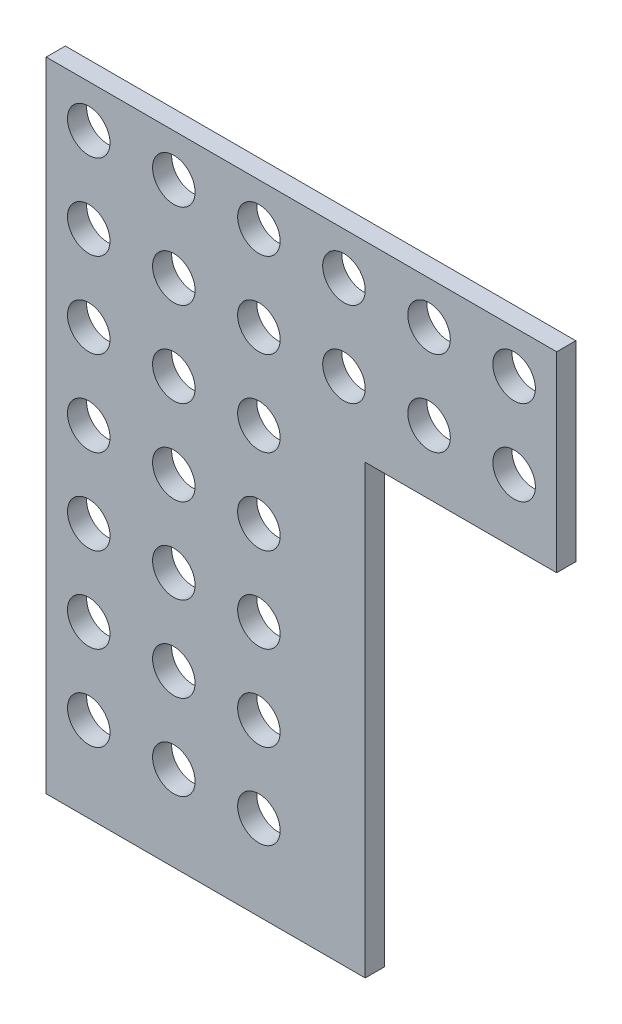
ISO-10303-21;
HEADER;
FILE_DESCRIPTION(('STEP AP214'),'2;1');
FILE_NAME('part.step','',(''),(''),'','','');
FILE_SCHEMA(('AUTOMOTIVE_DESIGN { 1 0 10303 214 1 1 1 1 }'));
ENDSEC;
DATA;
#1=APPLICATION_CONTEXT('core data for automotive mechanical design processes');
#2=APPLICATION_PROTOCOL_DEFINITION('international standard','automotive_design',2000,#1);
#3=PRODUCT_CONTEXT('',#1,'mechanical');
#4=PRODUCT('Part','Part','',(#3));
#5=PRODUCT_RELATED_PRODUCT_CATEGORY('part','',(#4));
#6=PRODUCT_DEFINITION_FORMATION('','',#4);
#7=PRODUCT_DEFINITION_CONTEXT('part definition',#1,'design');
#8=PRODUCT_DEFINITION('design','',#6,#7);
#9=PRODUCT_DEFINITION_SHAPE('','',#8);
#10=(LENGTH_UNIT() NAMED_UNIT(*) SI_UNIT(.MILLI.,.METRE.));
#11=(NAMED_UNIT(*) PLANE_ANGLE_UNIT() SI_UNIT($,.RADIAN.));
#12=(NAMED_UNIT(*) SI_UNIT($,.STERADIAN.) SOLID_ANGLE_UNIT());
#13=UNCERTAINTY_MEASURE_WITH_UNIT(LENGTH_MEASURE(1.E-05),#10,'distance_accuracy_value','');
#14=(GEOMETRIC_REPRESENTATION_CONTEXT(3) GLOBAL_UNCERTAINTY_ASSIGNED_CONTEXT((#13)) GLOBAL_UNIT_ASSIGNED_CONTEXT((#10,
#11,#12)) REPRESENTATION_CONTEXT('',''));
#15=CARTESIAN_POINT('',(0.,0.,0.));
#16=DIRECTION('',(0.,0.,1.));
#17=DIRECTION('',(1.,0.,0.));
#18=AXIS2_PLACEMENT_3D('',#15,#16,#17);
#19=CARTESIAN_POINT('',(0.,-75.,4.5));
#20=DIRECTION('',(0.,-1.,0.));
#21=DIRECTION('',(0.,0.,-1.));
#22=AXIS2_PLACEMENT_3D('',#19,#20,#21);
#23=PLANE('',#22);
#24=DIRECTION('',(-1.,0.,0.));
#25=VECTOR('',#24,1.);
#26=CARTESIAN_POINT('',(0.,-75.,0.));
#27=LINE('',#26,#25);
#28=CARTESIAN_POINT('',(15.,-75.,0.));
#29=VERTEX_POINT('',#28);
#30=CARTESIAN_POINT('',(-60.,-75.,0.));
#31=VERTEX_POINT('',#30);
#32=EDGE_CURVE('E124',#29,#31,#27,.T.);
#33=ORIENTED_EDGE('',*,*,#32,.F.);
#34=DIRECTION('',(0.,0.,-1.));
#35=VECTOR('',#34,1.);
#36=CARTESIAN_POINT('',(15.,-75.,4.5));
#37=LINE('',#36,#35);
#38=CARTESIAN_POINT('',(15.,-75.,4.5));
#39=VERTEX_POINT('',#38);
#40=EDGE_CURVE('E12',#39,#29,#37,.T.);
#41=ORIENTED_EDGE('',*,*,#40,.F.);
#42=DIRECTION('',(-1.,0.,0.));
#43=VECTOR('',#42,1.);
#44=CARTESIAN_POINT('',(0.,-75.,4.5));
#45=LINE('',#44,#43);
#46=CARTESIAN_POINT('',(-60.,-75.,4.5));
#47=VERTEX_POINT('',#46);
#48=EDGE_CURVE('E139',#39,#47,#45,.T.);
#49=ORIENTED_EDGE('',*,*,#48,.T.);
#50=DIRECTION('',(0.,0.,-1.));
#51=VECTOR('',#50,1.);
#52=CARTESIAN_POINT('',(-60.,-75.,4.5));
#53=LINE('',#52,#51);
#54=EDGE_CURVE('E59',#47,#31,#53,.T.);
#55=ORIENTED_EDGE('',*,*,#54,.T.);
#56=EDGE_LOOP('',(#33,#41,#49,#55));
#57=FACE_BOUND('',#56,.T.);
#58=ADVANCED_FACE('F43',(#57),#23,.T.);
#59=CARTESIAN_POINT('',(15.,0.,4.5));
#60=DIRECTION('',(1.,0.,0.));
#61=DIRECTION('',(0.,1.,0.));
#62=AXIS2_PLACEMENT_3D('',#59,#60,#61);
#63=PLANE('',#62);
#64=DIRECTION('',(0.,-1.,0.));
#65=VECTOR('',#64,1.);
#66=CARTESIAN_POINT('',(15.,0.,0.));
#67=LINE('',#66,#65);
#68=CARTESIAN_POINT('',(15.,30.,0.));
#69=VERTEX_POINT('',#68);
#70=EDGE_CURVE('E126',#69,#29,#67,.T.);
#71=ORIENTED_EDGE('',*,*,#70,.F.);
#72=DIRECTION('',(0.,0.,-1.));
#73=VECTOR('',#72,1.);
#74=CARTESIAN_POINT('',(15.,30.,4.5));
#75=LINE('',#74,#73);
#76=CARTESIAN_POINT('',(15.,30.,4.5));
#77=VERTEX_POINT('',#76);
#78=EDGE_CURVE('E51',#77,#69,#75,.T.);
#79=ORIENTED_EDGE('',*,*,#78,.F.);
#80=DIRECTION('',(0.,-1.,0.));
#81=VECTOR('',#80,1.);
#82=CARTESIAN_POINT('',(15.,0.,4.5));
#83=LINE('',#82,#81);
#84=EDGE_CURVE('E613',#77,#39,#83,.T.);
#85=ORIENTED_EDGE('',*,*,#84,.T.);
#86=ORIENTED_EDGE('',*,*,#40,.T.);
#87=EDGE_LOOP('',(#71,#79,#85,#86));
#88=FACE_BOUND('',#87,.T.);
#89=ADVANCED_FACE('F148',(#88),#63,.T.);
#90=CARTESIAN_POINT('',(0.,30.,4.5));
#91=DIRECTION('',(0.,-1.,0.));
#92=DIRECTION('',(1.,0.,0.));
#93=AXIS2_PLACEMENT_3D('',#90,#91,#92);
#94=PLANE('',#93);
#95=DIRECTION('',(-1.,0.,0.));
#96=VECTOR('',#95,1.);
#97=CARTESIAN_POINT('',(0.,30.,0.));
#98=LINE('',#97,#96);
#99=CARTESIAN_POINT('',(60.,30.,0.));
#100=VERTEX_POINT('',#99);
#101=EDGE_CURVE('E130',#100,#69,#98,.T.);
#102=ORIENTED_EDGE('',*,*,#101,.F.);
#103=DIRECTION('',(0.,0.,-1.));
#104=VECTOR('',#103,1.);
#105=CARTESIAN_POINT('',(60.,30.,4.5));
#106=LINE('',#105,#104);
#107=CARTESIAN_POINT('',(60.,30.,4.5));
#108=VERTEX_POINT('',#107);
#109=EDGE_CURVE('E106',#108,#100,#106,.T.);
#110=ORIENTED_EDGE('',*,*,#109,.F.);
#111=DIRECTION('',(-1.,0.,0.));
#112=VECTOR('',#111,1.);
#113=CARTESIAN_POINT('',(0.,30.,4.5));
#114=LINE('',#113,#112);
#115=EDGE_CURVE('E116',#108,#77,#114,.T.);
#116=ORIENTED_EDGE('',*,*,#115,.T.);
#117=ORIENTED_EDGE('',*,*,#78,.T.);
#118=EDGE_LOOP('',(#102,#110,#116,#117));
#119=FACE_BOUND('',#118,.T.);
#120=ADVANCED_FACE('F145',(#119),#94,.T.);
#121=CARTESIAN_POINT('',(60.,0.,4.5));
#122=DIRECTION('',(1.,0.,0.));
#123=DIRECTION('',(0.,1.,0.));
#124=AXIS2_PLACEMENT_3D('',#121,#122,#123);
#125=PLANE('',#124);
#126=DIRECTION('',(0.,-1.,0.));
#127=VECTOR('',#126,1.);
#128=CARTESIAN_POINT('',(60.,0.,0.));
#129=LINE('',#128,#127);
#130=CARTESIAN_POINT('',(60.,75.,0.));
#131=VERTEX_POINT('',#130);
#132=EDGE_CURVE('E102',#131,#100,#129,.T.);
#133=ORIENTED_EDGE('',*,*,#132,.F.);
#134=DIRECTION('',(0.,0.,-1.));
#135=VECTOR('',#134,1.);
#136=CARTESIAN_POINT('',(60.,75.,4.5));
#137=LINE('',#136,#135);
#138=CARTESIAN_POINT('',(60.,75.,4.5));
#139=VERTEX_POINT('',#138);
#140=EDGE_CURVE('E97',#139,#131,#137,.T.);
#141=ORIENTED_EDGE('',*,*,#140,.F.);
#142=DIRECTION('',(0.,-1.,0.));
#143=VECTOR('',#142,1.);
#144=CARTESIAN_POINT('',(60.,0.,4.5));
#145=LINE('',#144,#143);
#146=EDGE_CURVE('E100',#139,#108,#145,.T.);
#147=ORIENTED_EDGE('',*,*,#146,.T.);
#148=ORIENTED_EDGE('',*,*,#109,.T.);
#149=EDGE_LOOP('',(#133,#141,#147,#148));
#150=FACE_BOUND('',#149,.T.);
#151=ADVANCED_FACE('F99',(#150),#125,.T.);
#152=CARTESIAN_POINT('',(0.,75.,4.5));
#153=DIRECTION('',(0.,1.,0.));
#154=DIRECTION('',(-1.,0.,0.));
#155=AXIS2_PLACEMENT_3D('',#152,#153,#154);
#156=PLANE('',#155);
#157=DIRECTION('',(1.,0.,0.));
#158=VECTOR('',#157,1.);
#159=CARTESIAN_POINT('',(0.,75.,0.));
#160=LINE('',#159,#158);
#161=CARTESIAN_POINT('',(-60.,75.,0.));
#162=VERTEX_POINT('',#161);
#163=EDGE_CURVE('E134',#162,#131,#160,.T.);
#164=ORIENTED_EDGE('',*,*,#163,.F.);
#165=DIRECTION('',(0.,0.,-1.));
#166=VECTOR('',#165,1.);
#167=CARTESIAN_POINT('',(-60.,75.,4.5));
#168=LINE('',#167,#166);
#169=CARTESIAN_POINT('',(-60.,75.,4.5));
#170=VERTEX_POINT('',#169);
#171=EDGE_CURVE('E78',#170,#162,#168,.T.);
#172=ORIENTED_EDGE('',*,*,#171,.F.);
#173=DIRECTION('',(1.,0.,0.));
#174=VECTOR('',#173,1.);
#175=CARTESIAN_POINT('',(0.,75.,4.5));
#176=LINE('',#175,#174);
#177=EDGE_CURVE('E113',#170,#139,#176,.T.);
#178=ORIENTED_EDGE('',*,*,#177,.T.);
#179=ORIENTED_EDGE('',*,*,#140,.T.);
#180=EDGE_LOOP('',(#164,#172,#178,#179));
#181=FACE_BOUND('',#180,.T.);
#182=ADVANCED_FACE('F118',(#181),#156,.T.);
#183=CARTESIAN_POINT('',(-60.,0.,4.5));
#184=DIRECTION('',(-1.,0.,0.));
#185=DIRECTION('',(0.,-1.,0.));
#186=AXIS2_PLACEMENT_3D('',#183,#184,#185);
#187=PLANE('',#186);
#188=DIRECTION('',(0.,1.,0.));
#189=VECTOR('',#188,1.);
#190=CARTESIAN_POINT('',(-60.,0.,0.));
#191=LINE('',#190,#189);
#192=EDGE_CURVE('E136',#31,#162,#191,.T.);
#193=ORIENTED_EDGE('',*,*,#192,.F.);
#194=ORIENTED_EDGE('',*,*,#54,.F.);
#195=DIRECTION('',(0.,1.,0.));
#196=VECTOR('',#195,1.);
#197=CARTESIAN_POINT('',(-60.,0.,4.5));
#198=LINE('',#197,#196);
#199=EDGE_CURVE('E119',#47,#170,#198,.T.);
#200=ORIENTED_EDGE('',*,*,#199,.T.);
#201=ORIENTED_EDGE('',*,*,#171,.T.);
#202=EDGE_LOOP('',(#193,#194,#200,#201));
#203=FACE_BOUND('',#202,.T.);
#204=ADVANCED_FACE('F151',(#203),#187,.T.);
#205=CARTESIAN_POINT('',(0.,0.,4.5));
#206=DIRECTION('',(0.,0.,1.));
#207=DIRECTION('',(1.,0.,0.));
#208=AXIS2_PLACEMENT_3D('',#205,#206,#207);
#209=PLANE('',#208);
#210=CARTESIAN_POINT('',(10.0000000000001,45.0000000000001,4.5));
#211=DIRECTION('',(0.,0.,1.));
#212=DIRECTION('',(1.,0.,0.));
#213=AXIS2_PLACEMENT_3D('',#210,#211,#212);
#214=CIRCLE('',#213,5.);
#215=CARTESIAN_POINT('',(15.0000000000001,45.0000000000001,4.5));
#216=VERTEX_POINT('',#215);
#217=EDGE_CURVE('E529',#216,#216,#214,.T.);
#218=ORIENTED_EDGE('',*,*,#217,.F.);
#219=EDGE_LOOP('',(#218));
#220=FACE_BOUND('',#219,.T.);
#221=CARTESIAN_POINT('',(-9.99999999999986,5.00000000000009,4.5));
#222=DIRECTION('',(0.,0.,1.));
#223=DIRECTION('',(1.,0.,0.));
#224=AXIS2_PLACEMENT_3D('',#221,#222,#223);
#225=CIRCLE('',#224,5.);
#226=CARTESIAN_POINT('',(-4.99999999999986,5.00000000000009,4.5));
#227=VERTEX_POINT('',#226);
#228=EDGE_CURVE('E535',#227,#227,#225,.T.);
#229=ORIENTED_EDGE('',*,*,#228,.F.);
#230=EDGE_LOOP('',(#229));
#231=FACE_BOUND('',#230,.T.);
#232=CARTESIAN_POINT('',(-29.9999999999999,5.00000000000005,4.5));
#233=DIRECTION('',(0.,0.,1.));
#234=DIRECTION('',(1.,0.,0.));
#235=AXIS2_PLACEMENT_3D('',#232,#233,#234);
#236=CIRCLE('',#235,5.);
#237=CARTESIAN_POINT('',(-24.9999999999999,5.00000000000005,4.5));
#238=VERTEX_POINT('',#237);
#239=EDGE_CURVE('E544',#238,#238,#236,.T.);
#240=ORIENTED_EDGE('',*,*,#239,.F.);
#241=EDGE_LOOP('',(#240));
#242=FACE_BOUND('',#241,.T.);
#243=CARTESIAN_POINT('',(-49.9999999999999,5.,4.5));
#244=DIRECTION('',(0.,0.,1.));
#245=DIRECTION('',(1.,0.,0.));
#246=AXIS2_PLACEMENT_3D('',#243,#244,#245);
#247=CIRCLE('',#246,5.);
#248=CARTESIAN_POINT('',(-44.9999999999999,5.,4.5));
#249=VERTEX_POINT('',#248);
#250=EDGE_CURVE('E550',#249,#249,#247,.T.);
#251=ORIENTED_EDGE('',*,*,#250,.F.);
#252=EDGE_LOOP('',(#251));
#253=FACE_BOUND('',#252,.T.);
#254=CARTESIAN_POINT('',(30.,65.0000000000002,4.5));
#255=DIRECTION('',(0.,0.,1.));
#256=DIRECTION('',(1.,0.,0.));
#257=AXIS2_PLACEMENT_3D('',#254,#255,#256);
#258=CIRCLE('',#257,5.);
#259=CARTESIAN_POINT('',(35.,65.0000000000002,4.5));
#260=VERTEX_POINT('',#259);
#261=EDGE_CURVE('E701',#260,#260,#258,.T.);
#262=ORIENTED_EDGE('',*,*,#261,.F.);
#263=EDGE_LOOP('',(#262));
#264=FACE_BOUND('',#263,.T.);
#265=CARTESIAN_POINT('',(30.0000000000001,45.0000000000001,4.5));
#266=DIRECTION('',(0.,0.,1.));
#267=DIRECTION('',(1.,0.,0.));
#268=AXIS2_PLACEMENT_3D('',#265,#266,#267);
#269=CIRCLE('',#268,5.);
#270=CARTESIAN_POINT('',(35.0000000000001,45.0000000000001,4.5));
#271=VERTEX_POINT('',#270);
#272=EDGE_CURVE('E707',#271,#271,#269,.T.);
#273=ORIENTED_EDGE('',*,*,#272,.F.);
#274=EDGE_LOOP('',(#273));
#275=FACE_BOUND('',#274,.T.);
#276=CARTESIAN_POINT('',(-9.99999999999982,-14.9999999999999,4.5));
#277=DIRECTION('',(0.,0.,1.));
#278=DIRECTION('',(1.,0.,0.));
#279=AXIS2_PLACEMENT_3D('',#276,#277,#278);
#280=CIRCLE('',#279,5.);
#281=CARTESIAN_POINT('',(-4.99999999999982,-14.9999999999999,4.5));
#282=VERTEX_POINT('',#281);
#283=EDGE_CURVE('E713',#282,#282,#280,.T.);
#284=ORIENTED_EDGE('',*,*,#283,.F.);
#285=EDGE_LOOP('',(#284));
#286=FACE_BOUND('',#285,.T.);
#287=CARTESIAN_POINT('',(-29.9999999999998,-14.9999999999999,4.5));
#288=DIRECTION('',(0.,0.,1.));
#289=DIRECTION('',(1.,0.,0.));
#290=AXIS2_PLACEMENT_3D('',#287,#288,#289);
#291=CIRCLE('',#290,5.);
#292=CARTESIAN_POINT('',(-24.9999999999998,-14.9999999999999,4.5));
#293=VERTEX_POINT('',#292);
#294=EDGE_CURVE('E693',#293,#293,#291,.T.);
#295=ORIENTED_EDGE('',*,*,#294,.F.);
#296=EDGE_LOOP('',(#295));
#297=FACE_BOUND('',#296,.T.);
#298=CARTESIAN_POINT('',(-29.9999999999999,45.0000000000001,4.5));
#299=DIRECTION('',(0.,0.,1.));
#300=DIRECTION('',(1.,0.,0.));
#301=AXIS2_PLACEMENT_3D('',#298,#299,#300);
#302=CIRCLE('',#301,5.);
#303=CARTESIAN_POINT('',(-24.9999999999999,45.0000000000001,4.5));
#304=VERTEX_POINT('',#303);
#305=EDGE_CURVE('E582',#304,#304,#302,.T.);
#306=ORIENTED_EDGE('',*,*,#305,.F.);
#307=EDGE_LOOP('',(#306));
#308=FACE_BOUND('',#307,.T.);
#309=CARTESIAN_POINT('',(-50.,45.,4.5));
#310=DIRECTION('',(0.,0.,1.));
#311=DIRECTION('',(1.,0.,0.));
#312=AXIS2_PLACEMENT_3D('',#309,#310,#311);
#313=CIRCLE('',#312,5.);
#314=CARTESIAN_POINT('',(-45.,45.,4.5));
#315=VERTEX_POINT('',#314);
#316=EDGE_CURVE('E588',#315,#315,#313,.T.);
#317=ORIENTED_EDGE('',*,*,#316,.F.);
#318=EDGE_LOOP('',(#317));
#319=FACE_BOUND('',#318,.T.);
#320=CARTESIAN_POINT('',(-9.99999999999998,65.0000000000001,4.5));
#321=DIRECTION('',(0.,0.,1.));
#322=DIRECTION('',(1.,0.,0.));
#323=AXIS2_PLACEMENT_3D('',#320,#321,#322);
#324=CIRCLE('',#323,5.);
#325=CARTESIAN_POINT('',(-4.99999999999998,65.0000000000001,4.5));
#326=VERTEX_POINT('',#325);
#327=EDGE_CURVE('E594',#326,#326,#324,.T.);
#328=ORIENTED_EDGE('',*,*,#327,.F.);
#329=EDGE_LOOP('',(#328));
#330=FACE_BOUND('',#329,.T.);
#331=CARTESIAN_POINT('',(-9.99999999999995,45.0000000000001,4.5));
#332=DIRECTION('',(0.,0.,1.));
#333=DIRECTION('',(1.,0.,0.));
#334=AXIS2_PLACEMENT_3D('',#331,#332,#333);
#335=CIRCLE('',#334,5.);
#336=CARTESIAN_POINT('',(-4.99999999999995,45.0000000000001,4.5));
#337=VERTEX_POINT('',#336);
#338=EDGE_CURVE('E569',#337,#337,#335,.T.);
#339=ORIENTED_EDGE('',*,*,#338,.F.);
#340=EDGE_LOOP('',(#339));
#341=FACE_BOUND('',#340,.T.);
#342=CARTESIAN_POINT('',(10.,65.0000000000001,4.5));
#343=DIRECTION('',(0.,0.,1.));
#344=DIRECTION('',(1.,0.,0.));
#345=AXIS2_PLACEMENT_3D('',#342,#343,#344);
#346=CIRCLE('',#345,5.);
#347=CARTESIAN_POINT('',(15.,65.0000000000001,4.5));
#348=VERTEX_POINT('',#347);
#349=EDGE_CURVE('E532',#348,#348,#346,.T.);
#350=ORIENTED_EDGE('',*,*,#349,.F.);
#351=EDGE_LOOP('',(#350));
#352=FACE_BOUND('',#351,.T.);
#353=CARTESIAN_POINT('',(-49.9999999999999,25.,4.5));
#354=DIRECTION('',(0.,0.,1.));
#355=DIRECTION('',(1.,0.,0.));
#356=AXIS2_PLACEMENT_3D('',#353,#354,#355);
#357=CIRCLE('',#356,5.);
#358=CARTESIAN_POINT('',(-44.9999999999999,25.,4.5));
#359=VERTEX_POINT('',#358);
#360=EDGE_CURVE('E558',#359,#359,#357,.T.);
#361=ORIENTED_EDGE('',*,*,#360,.F.);
#362=EDGE_LOOP('',(#361));
#363=FACE_BOUND('',#362,.T.);
#364=CARTESIAN_POINT('',(-29.9999999999999,25.0000000000001,4.5));
#365=DIRECTION('',(0.,0.,1.));
#366=DIRECTION('',(1.,0.,0.));
#367=AXIS2_PLACEMENT_3D('',#364,#365,#366);
#368=CIRCLE('',#367,5.);
#369=CARTESIAN_POINT('',(-24.9999999999999,25.0000000000001,4.5));
#370=VERTEX_POINT('',#369);
#371=EDGE_CURVE('E557',#370,#370,#368,.T.);
#372=ORIENTED_EDGE('',*,*,#371,.F.);
#373=EDGE_LOOP('',(#372));
#374=FACE_BOUND('',#373,.T.);
#375=CARTESIAN_POINT('',(-9.99999999999991,25.0000000000001,4.5));
#376=DIRECTION('',(0.,0.,1.));
#377=DIRECTION('',(1.,0.,0.));
#378=AXIS2_PLACEMENT_3D('',#375,#376,#377);
#379=CIRCLE('',#378,5.);
#380=CARTESIAN_POINT('',(-4.99999999999991,25.0000000000001,4.5));
#381=VERTEX_POINT('',#380);
#382=EDGE_CURVE('E570',#381,#381,#379,.T.);
#383=ORIENTED_EDGE('',*,*,#382,.F.);
#384=EDGE_LOOP('',(#383));
#385=FACE_BOUND('',#384,.T.);
#386=CARTESIAN_POINT('',(-49.9999999999997,-55.,4.5));
#387=DIRECTION('',(0.,0.,1.));
#388=DIRECTION('',(1.,0.,0.));
#389=AXIS2_PLACEMENT_3D('',#386,#387,#388);
#390=CIRCLE('',#389,5.);
#391=CARTESIAN_POINT('',(-44.9999999999997,-55.,4.5));
#392=VERTEX_POINT('',#391);
#393=EDGE_CURVE('E639',#392,#392,#390,.T.);
#394=ORIENTED_EDGE('',*,*,#393,.F.);
#395=EDGE_LOOP('',(#394));
#396=FACE_BOUND('',#395,.T.);
#397=CARTESIAN_POINT('',(-9.99999999999978,-34.9999999999999,4.5));
#398=DIRECTION('',(0.,0.,1.));
#399=DIRECTION('',(1.,0.,0.));
#400=AXIS2_PLACEMENT_3D('',#397,#398,#399);
#401=CIRCLE('',#400,5.);
#402=CARTESIAN_POINT('',(-4.99999999999978,-34.9999999999999,4.5));
#403=VERTEX_POINT('',#402);
#404=EDGE_CURVE('E643',#403,#403,#401,.T.);
#405=ORIENTED_EDGE('',*,*,#404,.F.);
#406=EDGE_LOOP('',(#405));
#407=FACE_BOUND('',#406,.T.);
#408=CARTESIAN_POINT('',(50.0000000000001,45.0000000000002,4.5));
#409=DIRECTION('',(0.,0.,1.));
#410=DIRECTION('',(1.,0.,0.));
#411=AXIS2_PLACEMENT_3D('',#408,#409,#410);
#412=CIRCLE('',#411,5.);
#413=CARTESIAN_POINT('',(55.0000000000001,45.0000000000002,4.5));
#414=VERTEX_POINT('',#413);
#415=EDGE_CURVE('E647',#414,#414,#412,.T.);
#416=ORIENTED_EDGE('',*,*,#415,.F.);
#417=EDGE_LOOP('',(#416));
#418=FACE_BOUND('',#417,.T.);
#419=CARTESIAN_POINT('',(50.,65.0000000000002,4.5));
#420=DIRECTION('',(0.,0.,1.));
#421=DIRECTION('',(1.,0.,0.));
#422=AXIS2_PLACEMENT_3D('',#419,#420,#421);
#423=CIRCLE('',#422,5.);
#424=CARTESIAN_POINT('',(55.,65.0000000000002,4.5));
#425=VERTEX_POINT('',#424);
#426=EDGE_CURVE('E651',#425,#425,#423,.T.);
#427=ORIENTED_EDGE('',*,*,#426,.F.);
#428=EDGE_LOOP('',(#427));
#429=FACE_BOUND('',#428,.T.);
#430=CARTESIAN_POINT('',(-49.9999999999998,-15.,4.5));
#431=DIRECTION('',(0.,0.,1.));
#432=DIRECTION('',(1.,0.,0.));
#433=AXIS2_PLACEMENT_3D('',#430,#431,#432);
#434=CIRCLE('',#433,5.);
#435=CARTESIAN_POINT('',(-44.9999999999998,-15.,4.5));
#436=VERTEX_POINT('',#435);
#437=EDGE_CURVE('E655',#436,#436,#434,.T.);
#438=ORIENTED_EDGE('',*,*,#437,.F.);
#439=EDGE_LOOP('',(#438));
#440=FACE_BOUND('',#439,.T.);
#441=CARTESIAN_POINT('',(-29.9999999999998,-34.9999999999999,4.5));
#442=DIRECTION('',(0.,0.,1.));
#443=DIRECTION('',(1.,0.,0.));
#444=AXIS2_PLACEMENT_3D('',#441,#442,#443);
#445=CIRCLE('',#444,5.);
#446=CARTESIAN_POINT('',(-24.9999999999998,-34.9999999999999,4.5));
#447=VERTEX_POINT('',#446);
#448=EDGE_CURVE('E659',#447,#447,#445,.T.);
#449=ORIENTED_EDGE('',*,*,#448,.F.);
#450=EDGE_LOOP('',(#449));
#451=FACE_BOUND('',#450,.T.);
#452=CARTESIAN_POINT('',(-49.9999999999998,-35.,4.5));
#453=DIRECTION('',(0.,0.,1.));
#454=DIRECTION('',(1.,0.,0.));
#455=AXIS2_PLACEMENT_3D('',#452,#453,#454);
#456=CIRCLE('',#455,5.);
#457=CARTESIAN_POINT('',(-44.9999999999998,-35.,4.5));
#458=VERTEX_POINT('',#457);
#459=EDGE_CURVE('E663',#458,#458,#456,.T.);
#460=ORIENTED_EDGE('',*,*,#459,.F.);
#461=EDGE_LOOP('',(#460));
#462=FACE_BOUND('',#461,.T.);
#463=CARTESIAN_POINT('',(-9.99999999999972,-54.9999999999999,4.5));
#464=DIRECTION('',(0.,0.,1.));
#465=DIRECTION('',(1.,0.,0.));
#466=AXIS2_PLACEMENT_3D('',#463,#464,#465);
#467=CIRCLE('',#466,5.);
#468=CARTESIAN_POINT('',(-4.99999999999972,-54.9999999999999,4.5));
#469=VERTEX_POINT('',#468);
#470=EDGE_CURVE('E667',#469,#469,#467,.T.);
#471=ORIENTED_EDGE('',*,*,#470,.F.);
#472=EDGE_LOOP('',(#471));
#473=FACE_BOUND('',#472,.T.);
#474=CARTESIAN_POINT('',(-29.9999999999997,-55.,4.5));
#475=DIRECTION('',(0.,0.,1.));
#476=DIRECTION('',(1.,0.,0.));
#477=AXIS2_PLACEMENT_3D('',#474,#475,#476);
#478=CIRCLE('',#477,5.);
#479=CARTESIAN_POINT('',(-24.9999999999997,-55.,4.5));
#480=VERTEX_POINT('',#479);
#481=EDGE_CURVE('E670',#480,#480,#478,.T.);
#482=ORIENTED_EDGE('',*,*,#481,.F.);
#483=EDGE_LOOP('',(#482));
#484=FACE_BOUND('',#483,.T.);
#485=CARTESIAN_POINT('',(-30.,65.,4.5));
#486=DIRECTION('',(0.,0.,1.));
#487=DIRECTION('',(1.,0.,0.));
#488=AXIS2_PLACEMENT_3D('',#485,#486,#487);
#489=CIRCLE('',#488,5.);
#490=CARTESIAN_POINT('',(-25.,65.,4.5));
#491=VERTEX_POINT('',#490);
#492=EDGE_CURVE('E581',#491,#491,#489,.T.);
#493=ORIENTED_EDGE('',*,*,#492,.F.);
#494=EDGE_LOOP('',(#493));
#495=FACE_BOUND('',#494,.T.);
#496=CARTESIAN_POINT('',(-50.,65.,4.5));
#497=DIRECTION('',(0.,0.,1.));
#498=DIRECTION('',(1.,0.,0.));
#499=AXIS2_PLACEMENT_3D('',#496,#497,#498);
#500=CIRCLE('',#499,5.);
#501=CARTESIAN_POINT('',(-45.,65.,4.5));
#502=VERTEX_POINT('',#501);
#503=EDGE_CURVE('E605',#502,#502,#500,.T.);
#504=ORIENTED_EDGE('',*,*,#503,.F.);
#505=EDGE_LOOP('',(#504));
#506=FACE_BOUND('',#505,.T.);
#507=ORIENTED_EDGE('',*,*,#48,.F.);
#508=ORIENTED_EDGE('',*,*,#84,.F.);
#509=ORIENTED_EDGE('',*,*,#115,.F.);
#510=ORIENTED_EDGE('',*,*,#146,.F.);
#511=ORIENTED_EDGE('',*,*,#177,.F.);
#512=ORIENTED_EDGE('',*,*,#199,.F.);
#513=EDGE_LOOP('',(#507,#508,#509,#510,#511,#512));
#514=FACE_BOUND('',#513,.T.);
#515=ADVANCED_FACE('F111',(#220,#231,#242,#253,#264,#275,#286,#297,#308,#319,#330,#341,#352,
#363,#374,#385,#396,#407,#418,#429,#440,#451,#462,#473,#484,#495,#506,#514),#209,.T.);
#516=CARTESIAN_POINT('',(0.,0.,0.));
#517=DIRECTION('',(0.,0.,1.));
#518=DIRECTION('',(1.,0.,0.));
#519=AXIS2_PLACEMENT_3D('',#516,#517,#518);
#520=PLANE('',#519);
#521=CARTESIAN_POINT('',(10.0000000000001,45.0000000000001,0.));
#522=DIRECTION('',(0.,0.,1.));
#523=DIRECTION('',(1.,0.,0.));
#524=AXIS2_PLACEMENT_3D('',#521,#522,#523);
#525=CIRCLE('',#524,5.);
#526=CARTESIAN_POINT('',(15.0000000000001,45.0000000000001,0.));
#527=VERTEX_POINT('',#526);
#528=EDGE_CURVE('E526',#527,#527,#525,.T.);
#529=ORIENTED_EDGE('',*,*,#528,.T.);
#530=EDGE_LOOP('',(#529));
#531=FACE_BOUND('',#530,.T.);
#532=CARTESIAN_POINT('',(-9.99999999999986,5.00000000000009,0.));
#533=DIRECTION('',(0.,0.,1.));
#534=DIRECTION('',(1.,0.,0.));
#535=AXIS2_PLACEMENT_3D('',#532,#533,#534);
#536=CIRCLE('',#535,5.);
#537=CARTESIAN_POINT('',(-4.99999999999986,5.00000000000009,0.));
#538=VERTEX_POINT('',#537);
#539=EDGE_CURVE('E530',#538,#538,#536,.T.);
#540=ORIENTED_EDGE('',*,*,#539,.T.);
#541=EDGE_LOOP('',(#540));
#542=FACE_BOUND('',#541,.T.);
#543=CARTESIAN_POINT('',(-29.9999999999999,5.00000000000005,0.));
#544=DIRECTION('',(0.,0.,1.));
#545=DIRECTION('',(1.,0.,0.));
#546=AXIS2_PLACEMENT_3D('',#543,#544,#545);
#547=CIRCLE('',#546,5.);
#548=CARTESIAN_POINT('',(-24.9999999999999,5.00000000000005,0.));
#549=VERTEX_POINT('',#548);
#550=EDGE_CURVE('E541',#549,#549,#547,.T.);
#551=ORIENTED_EDGE('',*,*,#550,.T.);
#552=EDGE_LOOP('',(#551));
#553=FACE_BOUND('',#552,.T.);
#554=CARTESIAN_POINT('',(-49.9999999999999,5.,0.));
#555=DIRECTION('',(0.,0.,1.));
#556=DIRECTION('',(1.,0.,0.));
#557=AXIS2_PLACEMENT_3D('',#554,#555,#556);
#558=CIRCLE('',#557,5.);
#559=CARTESIAN_POINT('',(-44.9999999999999,5.,0.));
#560=VERTEX_POINT('',#559);
#561=EDGE_CURVE('E547',#560,#560,#558,.T.);
#562=ORIENTED_EDGE('',*,*,#561,.T.);
#563=EDGE_LOOP('',(#562));
#564=FACE_BOUND('',#563,.T.);
#565=CARTESIAN_POINT('',(30.,65.0000000000002,0.));
#566=DIRECTION('',(0.,0.,1.));
#567=DIRECTION('',(1.,0.,0.));
#568=AXIS2_PLACEMENT_3D('',#565,#566,#567);
#569=CIRCLE('',#568,5.);
#570=CARTESIAN_POINT('',(35.,65.0000000000002,0.));
#571=VERTEX_POINT('',#570);
#572=EDGE_CURVE('E553',#571,#571,#569,.T.);
#573=ORIENTED_EDGE('',*,*,#572,.T.);
#574=EDGE_LOOP('',(#573));
#575=FACE_BOUND('',#574,.T.);
#576=CARTESIAN_POINT('',(30.0000000000001,45.0000000000001,0.));
#577=DIRECTION('',(0.,0.,1.));
#578=DIRECTION('',(1.,0.,0.));
#579=AXIS2_PLACEMENT_3D('',#576,#577,#578);
#580=CIRCLE('',#579,5.);
#581=CARTESIAN_POINT('',(35.0000000000001,45.0000000000001,0.));
#582=VERTEX_POINT('',#581);
#583=EDGE_CURVE('E704',#582,#582,#580,.T.);
#584=ORIENTED_EDGE('',*,*,#583,.T.);
#585=EDGE_LOOP('',(#584));
#586=FACE_BOUND('',#585,.T.);
#587=CARTESIAN_POINT('',(-9.99999999999982,-14.9999999999999,0.));
#588=DIRECTION('',(0.,0.,1.));
#589=DIRECTION('',(1.,0.,0.));
#590=AXIS2_PLACEMENT_3D('',#587,#588,#589);
#591=CIRCLE('',#590,5.);
#592=CARTESIAN_POINT('',(-4.99999999999982,-14.9999999999999,0.));
#593=VERTEX_POINT('',#592);
#594=EDGE_CURVE('E710',#593,#593,#591,.T.);
#595=ORIENTED_EDGE('',*,*,#594,.T.);
#596=EDGE_LOOP('',(#595));
#597=FACE_BOUND('',#596,.T.);
#598=CARTESIAN_POINT('',(-29.9999999999998,-14.9999999999999,0.));
#599=DIRECTION('',(0.,0.,1.));
#600=DIRECTION('',(1.,0.,0.));
#601=AXIS2_PLACEMENT_3D('',#598,#599,#600);
#602=CIRCLE('',#601,5.);
#603=CARTESIAN_POINT('',(-24.9999999999998,-14.9999999999999,0.));
#604=VERTEX_POINT('',#603);
#605=EDGE_CURVE('E716',#604,#604,#602,.T.);
#606=ORIENTED_EDGE('',*,*,#605,.T.);
#607=EDGE_LOOP('',(#606));
#608=FACE_BOUND('',#607,.T.);
#609=CARTESIAN_POINT('',(-29.9999999999999,45.0000000000001,0.));
#610=DIRECTION('',(0.,0.,1.));
#611=DIRECTION('',(1.,0.,0.));
#612=AXIS2_PLACEMENT_3D('',#609,#610,#611);
#613=CIRCLE('',#612,5.);
#614=CARTESIAN_POINT('',(-24.9999999999999,45.0000000000001,0.));
#615=VERTEX_POINT('',#614);
#616=EDGE_CURVE('E578',#615,#615,#613,.T.);
#617=ORIENTED_EDGE('',*,*,#616,.T.);
#618=EDGE_LOOP('',(#617));
#619=FACE_BOUND('',#618,.T.);
#620=CARTESIAN_POINT('',(-50.,45.,0.));
#621=DIRECTION('',(0.,0.,1.));
#622=DIRECTION('',(1.,0.,0.));
#623=AXIS2_PLACEMENT_3D('',#620,#621,#622);
#624=CIRCLE('',#623,5.);
#625=CARTESIAN_POINT('',(-45.,45.,0.));
#626=VERTEX_POINT('',#625);
#627=EDGE_CURVE('E585',#626,#626,#624,.T.);
#628=ORIENTED_EDGE('',*,*,#627,.T.);
#629=EDGE_LOOP('',(#628));
#630=FACE_BOUND('',#629,.T.);
#631=CARTESIAN_POINT('',(-9.99999999999998,65.0000000000001,0.));
#632=DIRECTION('',(0.,0.,1.));
#633=DIRECTION('',(1.,0.,0.));
#634=AXIS2_PLACEMENT_3D('',#631,#632,#633);
#635=CIRCLE('',#634,5.);
#636=CARTESIAN_POINT('',(-4.99999999999998,65.0000000000001,0.));
#637=VERTEX_POINT('',#636);
#638=EDGE_CURVE('E591',#637,#637,#635,.T.);
#639=ORIENTED_EDGE('',*,*,#638,.T.);
#640=EDGE_LOOP('',(#639));
#641=FACE_BOUND('',#640,.T.);
#642=CARTESIAN_POINT('',(-9.99999999999995,45.0000000000001,0.));
#643=DIRECTION('',(0.,0.,1.));
#644=DIRECTION('',(1.,0.,0.));
#645=AXIS2_PLACEMENT_3D('',#642,#643,#644);
#646=CIRCLE('',#645,5.);
#647=CARTESIAN_POINT('',(-4.99999999999995,45.0000000000001,0.));
#648=VERTEX_POINT('',#647);
#649=EDGE_CURVE('E597',#648,#648,#646,.T.);
#650=ORIENTED_EDGE('',*,*,#649,.T.);
#651=EDGE_LOOP('',(#650));
#652=FACE_BOUND('',#651,.T.);
#653=CARTESIAN_POINT('',(10.,65.0000000000001,0.));
#654=DIRECTION('',(0.,0.,1.));
#655=DIRECTION('',(1.,0.,0.));
#656=AXIS2_PLACEMENT_3D('',#653,#654,#655);
#657=CIRCLE('',#656,5.);
#658=CARTESIAN_POINT('',(15.,65.0000000000001,0.));
#659=VERTEX_POINT('',#658);
#660=EDGE_CURVE('E561',#659,#659,#657,.T.);
#661=ORIENTED_EDGE('',*,*,#660,.T.);
#662=EDGE_LOOP('',(#661));
#663=FACE_BOUND('',#662,.T.);
#664=CARTESIAN_POINT('',(-49.9999999999999,25.,0.));
#665=DIRECTION('',(0.,0.,1.));
#666=DIRECTION('',(1.,0.,0.));
#667=AXIS2_PLACEMENT_3D('',#664,#665,#666);
#668=CIRCLE('',#667,5.);
#669=CARTESIAN_POINT('',(-44.9999999999999,25.,0.));
#670=VERTEX_POINT('',#669);
#671=EDGE_CURVE('E554',#670,#670,#668,.T.);
#672=ORIENTED_EDGE('',*,*,#671,.T.);
#673=EDGE_LOOP('',(#672));
#674=FACE_BOUND('',#673,.T.);
#675=CARTESIAN_POINT('',(-29.9999999999999,25.0000000000001,0.));
#676=DIRECTION('',(0.,0.,1.));
#677=DIRECTION('',(1.,0.,0.));
#678=AXIS2_PLACEMENT_3D('',#675,#676,#677);
#679=CIRCLE('',#678,5.);
#680=CARTESIAN_POINT('',(-24.9999999999999,25.0000000000001,0.));
#681=VERTEX_POINT('',#680);
#682=EDGE_CURVE('E573',#681,#681,#679,.T.);
#683=ORIENTED_EDGE('',*,*,#682,.T.);
#684=EDGE_LOOP('',(#683));
#685=FACE_BOUND('',#684,.T.);
#686=CARTESIAN_POINT('',(-9.99999999999991,25.0000000000001,0.));
#687=DIRECTION('',(0.,0.,1.));
#688=DIRECTION('',(1.,0.,0.));
#689=AXIS2_PLACEMENT_3D('',#686,#687,#688);
#690=CIRCLE('',#689,5.);
#691=CARTESIAN_POINT('',(-4.99999999999991,25.0000000000001,0.));
#692=VERTEX_POINT('',#691);
#693=EDGE_CURVE('E566',#692,#692,#690,.T.);
#694=ORIENTED_EDGE('',*,*,#693,.T.);
#695=EDGE_LOOP('',(#694));
#696=FACE_BOUND('',#695,.T.);
#697=CARTESIAN_POINT('',(-49.9999999999997,-55.,0.));
#698=DIRECTION('',(0.,0.,1.));
#699=DIRECTION('',(1.,0.,0.));
#700=AXIS2_PLACEMENT_3D('',#697,#698,#699);
#701=CIRCLE('',#700,5.);
#702=CARTESIAN_POINT('',(-44.9999999999997,-55.,0.));
#703=VERTEX_POINT('',#702);
#704=EDGE_CURVE('E673',#703,#703,#701,.T.);
#705=ORIENTED_EDGE('',*,*,#704,.T.);
#706=EDGE_LOOP('',(#705));
#707=FACE_BOUND('',#706,.T.);
#708=CARTESIAN_POINT('',(-9.99999999999978,-34.9999999999999,0.));
#709=DIRECTION('',(0.,0.,1.));
#710=DIRECTION('',(1.,0.,0.));
#711=AXIS2_PLACEMENT_3D('',#708,#709,#710);
#712=CIRCLE('',#711,5.);
#713=CARTESIAN_POINT('',(-4.99999999999978,-34.9999999999999,0.));
#714=VERTEX_POINT('',#713);
#715=EDGE_CURVE('E685',#714,#714,#712,.T.);
#716=ORIENTED_EDGE('',*,*,#715,.T.);
#717=EDGE_LOOP('',(#716));
#718=FACE_BOUND('',#717,.T.);
#719=CARTESIAN_POINT('',(50.0000000000001,45.0000000000002,0.));
#720=DIRECTION('',(0.,0.,1.));
#721=DIRECTION('',(1.,0.,0.));
#722=AXIS2_PLACEMENT_3D('',#719,#720,#721);
#723=CIRCLE('',#722,5.);
#724=CARTESIAN_POINT('',(55.0000000000001,45.0000000000002,0.));
#725=VERTEX_POINT('',#724);
#726=EDGE_CURVE('E681',#725,#725,#723,.T.);
#727=ORIENTED_EDGE('',*,*,#726,.T.);
#728=EDGE_LOOP('',(#727));
#729=FACE_BOUND('',#728,.T.);
#730=CARTESIAN_POINT('',(50.,65.0000000000002,0.));
#731=DIRECTION('',(0.,0.,1.));
#732=DIRECTION('',(1.,0.,0.));
#733=AXIS2_PLACEMENT_3D('',#730,#731,#732);
#734=CIRCLE('',#733,5.);
#735=CARTESIAN_POINT('',(55.,65.0000000000002,0.));
#736=VERTEX_POINT('',#735);
#737=EDGE_CURVE('E695',#736,#736,#734,.T.);
#738=ORIENTED_EDGE('',*,*,#737,.T.);
#739=EDGE_LOOP('',(#738));
#740=FACE_BOUND('',#739,.T.);
#741=CARTESIAN_POINT('',(-49.9999999999998,-15.,0.));
#742=DIRECTION('',(0.,0.,1.));
#743=DIRECTION('',(1.,0.,0.));
#744=AXIS2_PLACEMENT_3D('',#741,#742,#743);
#745=CIRCLE('',#744,5.);
#746=CARTESIAN_POINT('',(-44.9999999999998,-15.,0.));
#747=VERTEX_POINT('',#746);
#748=EDGE_CURVE('E690',#747,#747,#745,.T.);
#749=ORIENTED_EDGE('',*,*,#748,.T.);
#750=EDGE_LOOP('',(#749));
#751=FACE_BOUND('',#750,.T.);
#752=CARTESIAN_POINT('',(-29.9999999999998,-34.9999999999999,0.));
#753=DIRECTION('',(0.,0.,1.));
#754=DIRECTION('',(1.,0.,0.));
#755=AXIS2_PLACEMENT_3D('',#752,#753,#754);
#756=CIRCLE('',#755,5.);
#757=CARTESIAN_POINT('',(-24.9999999999998,-34.9999999999999,0.));
#758=VERTEX_POINT('',#757);
#759=EDGE_CURVE('E689',#758,#758,#756,.T.);
#760=ORIENTED_EDGE('',*,*,#759,.T.);
#761=EDGE_LOOP('',(#760));
#762=FACE_BOUND('',#761,.T.);
#763=CARTESIAN_POINT('',(-49.9999999999998,-35.,0.));
#764=DIRECTION('',(0.,0.,1.));
#765=DIRECTION('',(1.,0.,0.));
#766=AXIS2_PLACEMENT_3D('',#763,#764,#765);
#767=CIRCLE('',#766,5.);
#768=CARTESIAN_POINT('',(-44.9999999999998,-35.,0.));
#769=VERTEX_POINT('',#768);
#770=EDGE_CURVE('E766',#769,#769,#767,.T.);
#771=ORIENTED_EDGE('',*,*,#770,.T.);
#772=EDGE_LOOP('',(#771));
#773=FACE_BOUND('',#772,.T.);
#774=CARTESIAN_POINT('',(-9.99999999999972,-54.9999999999999,0.));
#775=DIRECTION('',(0.,0.,1.));
#776=DIRECTION('',(1.,0.,0.));
#777=AXIS2_PLACEMENT_3D('',#774,#775,#776);
#778=CIRCLE('',#777,5.);
#779=CARTESIAN_POINT('',(-4.99999999999972,-54.9999999999999,0.));
#780=VERTEX_POINT('',#779);
#781=EDGE_CURVE('E770',#780,#780,#778,.T.);
#782=ORIENTED_EDGE('',*,*,#781,.T.);
#783=EDGE_LOOP('',(#782));
#784=FACE_BOUND('',#783,.T.);
#785=CARTESIAN_POINT('',(-29.9999999999997,-55.,0.));
#786=DIRECTION('',(0.,0.,1.));
#787=DIRECTION('',(1.,0.,0.));
#788=AXIS2_PLACEMENT_3D('',#785,#786,#787);
#789=CIRCLE('',#788,5.);
#790=CARTESIAN_POINT('',(-24.9999999999997,-55.,0.));
#791=VERTEX_POINT('',#790);
#792=EDGE_CURVE('E672',#791,#791,#789,.T.);
#793=ORIENTED_EDGE('',*,*,#792,.T.);
#794=EDGE_LOOP('',(#793));
#795=FACE_BOUND('',#794,.T.);
#796=CARTESIAN_POINT('',(-30.,65.,0.));
#797=DIRECTION('',(0.,0.,1.));
#798=DIRECTION('',(1.,0.,0.));
#799=AXIS2_PLACEMENT_3D('',#796,#797,#798);
#800=CIRCLE('',#799,5.);
#801=CARTESIAN_POINT('',(-25.,65.,0.));
#802=VERTEX_POINT('',#801);
#803=EDGE_CURVE('E602',#802,#802,#800,.T.);
#804=ORIENTED_EDGE('',*,*,#803,.T.);
#805=EDGE_LOOP('',(#804));
#806=FACE_BOUND('',#805,.T.);
#807=CARTESIAN_POINT('',(-50.,65.,0.));
#808=DIRECTION('',(0.,0.,1.));
#809=DIRECTION('',(1.,0.,0.));
#810=AXIS2_PLACEMENT_3D('',#807,#808,#809);
#811=CIRCLE('',#810,5.);
#812=CARTESIAN_POINT('',(-45.,65.,0.));
#813=VERTEX_POINT('',#812);
#814=EDGE_CURVE('E127',#813,#813,#811,.T.);
#815=ORIENTED_EDGE('',*,*,#814,.T.);
#816=EDGE_LOOP('',(#815));
#817=FACE_BOUND('',#816,.T.);
#818=ORIENTED_EDGE('',*,*,#32,.T.);
#819=ORIENTED_EDGE('',*,*,#192,.T.);
#820=ORIENTED_EDGE('',*,*,#163,.T.);
#821=ORIENTED_EDGE('',*,*,#132,.T.);
#822=ORIENTED_EDGE('',*,*,#101,.T.);
#823=ORIENTED_EDGE('',*,*,#70,.T.);
#824=EDGE_LOOP('',(#818,#819,#820,#821,#822,#823));
#825=FACE_BOUND('',#824,.T.);
#826=ADVANCED_FACE('F150',(#531,#542,#553,#564,#575,#586,#597,#608,#619,#630,#641,#652,#663,
#674,#685,#696,#707,#718,#729,#740,#751,#762,#773,#784,#795,#806,#817,#825),#520,.F.);
#827=CARTESIAN_POINT('',(-50.,65.,0.));
#828=DIRECTION('',(0.,0.,1.));
#829=DIRECTION('',(1.,0.,0.));
#830=AXIS2_PLACEMENT_3D('',#827,#828,#829);
#831=CYLINDRICAL_SURFACE('',#830,5.);
#832=ORIENTED_EDGE('',*,*,#814,.F.);
#833=EDGE_LOOP('',(#832));
#834=FACE_BOUND('',#833,.T.);
#835=ORIENTED_EDGE('',*,*,#503,.T.);
#836=EDGE_LOOP('',(#835));
#837=FACE_BOUND('',#836,.T.);
#838=ADVANCED_FACE('F190',(#834,#837),#831,.F.);
#839=CARTESIAN_POINT('',(-30.,65.,0.));
#840=DIRECTION('',(0.,0.,1.));
#841=DIRECTION('',(1.,0.,0.));
#842=AXIS2_PLACEMENT_3D('',#839,#840,#841);
#843=CYLINDRICAL_SURFACE('',#842,5.);
#844=ORIENTED_EDGE('',*,*,#803,.F.);
#845=EDGE_LOOP('',(#844));
#846=FACE_BOUND('',#845,.T.);
#847=ORIENTED_EDGE('',*,*,#492,.T.);
#848=EDGE_LOOP('',(#847));
#849=FACE_BOUND('',#848,.T.);
#850=ADVANCED_FACE('F195',(#846,#849),#843,.F.);
#851=CARTESIAN_POINT('',(-29.9999999999997,-55.,0.));
#852=DIRECTION('',(0.,0.,1.));
#853=DIRECTION('',(1.,0.,0.));
#854=AXIS2_PLACEMENT_3D('',#851,#852,#853);
#855=CYLINDRICAL_SURFACE('',#854,5.);
#856=ORIENTED_EDGE('',*,*,#792,.F.);
#857=EDGE_LOOP('',(#856));
#858=FACE_BOUND('',#857,.T.);
#859=ORIENTED_EDGE('',*,*,#481,.T.);
#860=EDGE_LOOP('',(#859));
#861=FACE_BOUND('',#860,.T.);
#862=ADVANCED_FACE('F218',(#858,#861),#855,.F.);
#863=CARTESIAN_POINT('',(-9.99999999999972,-54.9999999999999,0.));
#864=DIRECTION('',(0.,0.,1.));
#865=DIRECTION('',(1.,0.,0.));
#866=AXIS2_PLACEMENT_3D('',#863,#864,#865);
#867=CYLINDRICAL_SURFACE('',#866,5.);
#868=ORIENTED_EDGE('',*,*,#781,.F.);
#869=EDGE_LOOP('',(#868));
#870=FACE_BOUND('',#869,.T.);
#871=ORIENTED_EDGE('',*,*,#470,.T.);
#872=EDGE_LOOP('',(#871));
#873=FACE_BOUND('',#872,.T.);
#874=ADVANCED_FACE('F230',(#870,#873),#867,.F.);
#875=CARTESIAN_POINT('',(-49.9999999999998,-35.,0.));
#876=DIRECTION('',(0.,0.,1.));
#877=DIRECTION('',(1.,0.,0.));
#878=AXIS2_PLACEMENT_3D('',#875,#876,#877);
#879=CYLINDRICAL_SURFACE('',#878,5.);
#880=ORIENTED_EDGE('',*,*,#770,.F.);
#881=EDGE_LOOP('',(#880));
#882=FACE_BOUND('',#881,.T.);
#883=ORIENTED_EDGE('',*,*,#459,.T.);
#884=EDGE_LOOP('',(#883));
#885=FACE_BOUND('',#884,.T.);
#886=ADVANCED_FACE('F242',(#882,#885),#879,.F.);
#887=CARTESIAN_POINT('',(-29.9999999999998,-34.9999999999999,0.));
#888=DIRECTION('',(0.,0.,1.));
#889=DIRECTION('',(1.,0.,0.));
#890=AXIS2_PLACEMENT_3D('',#887,#888,#889);
#891=CYLINDRICAL_SURFACE('',#890,5.);
#892=ORIENTED_EDGE('',*,*,#759,.F.);
#893=EDGE_LOOP('',(#892));
#894=FACE_BOUND('',#893,.T.);
#895=ORIENTED_EDGE('',*,*,#448,.T.);
#896=EDGE_LOOP('',(#895));
#897=FACE_BOUND('',#896,.T.);
#898=ADVANCED_FACE('F253',(#894,#897),#891,.F.);
#899=CARTESIAN_POINT('',(-49.9999999999998,-15.,0.));
#900=DIRECTION('',(0.,0.,1.));
#901=DIRECTION('',(1.,0.,0.));
#902=AXIS2_PLACEMENT_3D('',#899,#900,#901);
#903=CYLINDRICAL_SURFACE('',#902,5.);
#904=ORIENTED_EDGE('',*,*,#748,.F.);
#905=EDGE_LOOP('',(#904));
#906=FACE_BOUND('',#905,.T.);
#907=ORIENTED_EDGE('',*,*,#437,.T.);
#908=EDGE_LOOP('',(#907));
#909=FACE_BOUND('',#908,.T.);
#910=ADVANCED_FACE('F264',(#906,#909),#903,.F.);
#911=CARTESIAN_POINT('',(50.,65.0000000000002,0.));
#912=DIRECTION('',(0.,0.,1.));
#913=DIRECTION('',(1.,0.,0.));
#914=AXIS2_PLACEMENT_3D('',#911,#912,#913);
#915=CYLINDRICAL_SURFACE('',#914,5.);
#916=ORIENTED_EDGE('',*,*,#737,.F.);
#917=EDGE_LOOP('',(#916));
#918=FACE_BOUND('',#917,.T.);
#919=ORIENTED_EDGE('',*,*,#426,.T.);
#920=EDGE_LOOP('',(#919));
#921=FACE_BOUND('',#920,.T.);
#922=ADVANCED_FACE('F276',(#918,#921),#915,.F.);
#923=CARTESIAN_POINT('',(50.0000000000001,45.0000000000002,0.));
#924=DIRECTION('',(0.,0.,1.));
#925=DIRECTION('',(1.,0.,0.));
#926=AXIS2_PLACEMENT_3D('',#923,#924,#925);
#927=CYLINDRICAL_SURFACE('',#926,5.);
#928=ORIENTED_EDGE('',*,*,#726,.F.);
#929=EDGE_LOOP('',(#928));
#930=FACE_BOUND('',#929,.T.);
#931=ORIENTED_EDGE('',*,*,#415,.T.);
#932=EDGE_LOOP('',(#931));
#933=FACE_BOUND('',#932,.T.);
#934=ADVANCED_FACE('F288',(#930,#933),#927,.F.);
#935=CARTESIAN_POINT('',(-9.99999999999978,-34.9999999999999,0.));
#936=DIRECTION('',(0.,0.,1.));
#937=DIRECTION('',(1.,0.,0.));
#938=AXIS2_PLACEMENT_3D('',#935,#936,#937);
#939=CYLINDRICAL_SURFACE('',#938,5.);
#940=ORIENTED_EDGE('',*,*,#715,.F.);
#941=EDGE_LOOP('',(#940));
#942=FACE_BOUND('',#941,.T.);
#943=ORIENTED_EDGE('',*,*,#404,.T.);
#944=EDGE_LOOP('',(#943));
#945=FACE_BOUND('',#944,.T.);
#946=ADVANCED_FACE('F299',(#942,#945),#939,.F.);
#947=CARTESIAN_POINT('',(-49.9999999999997,-55.,0.));
#948=DIRECTION('',(0.,0.,1.));
#949=DIRECTION('',(1.,0.,0.));
#950=AXIS2_PLACEMENT_3D('',#947,#948,#949);
#951=CYLINDRICAL_SURFACE('',#950,5.);
#952=ORIENTED_EDGE('',*,*,#704,.F.);
#953=EDGE_LOOP('',(#952));
#954=FACE_BOUND('',#953,.T.);
#955=ORIENTED_EDGE('',*,*,#393,.T.);
#956=EDGE_LOOP('',(#955));
#957=FACE_BOUND('',#956,.T.);
#958=ADVANCED_FACE('F309',(#954,#957),#951,.F.);
#959=CARTESIAN_POINT('',(-9.99999999999991,25.0000000000001,0.));
#960=DIRECTION('',(0.,0.,1.));
#961=DIRECTION('',(1.,0.,0.));
#962=AXIS2_PLACEMENT_3D('',#959,#960,#961);
#963=CYLINDRICAL_SURFACE('',#962,5.);
#964=ORIENTED_EDGE('',*,*,#693,.F.);
#965=EDGE_LOOP('',(#964));
#966=FACE_BOUND('',#965,.T.);
#967=ORIENTED_EDGE('',*,*,#382,.T.);
#968=EDGE_LOOP('',(#967));
#969=FACE_BOUND('',#968,.T.);
#970=ADVANCED_FACE('F319',(#966,#969),#963,.F.);
#971=CARTESIAN_POINT('',(-29.9999999999999,25.0000000000001,0.));
#972=DIRECTION('',(0.,0.,1.));
#973=DIRECTION('',(1.,0.,0.));
#974=AXIS2_PLACEMENT_3D('',#971,#972,#973);
#975=CYLINDRICAL_SURFACE('',#974,5.);
#976=ORIENTED_EDGE('',*,*,#682,.F.);
#977=EDGE_LOOP('',(#976));
#978=FACE_BOUND('',#977,.T.);
#979=ORIENTED_EDGE('',*,*,#371,.T.);
#980=EDGE_LOOP('',(#979));
#981=FACE_BOUND('',#980,.T.);
#982=ADVANCED_FACE('F330',(#978,#981),#975,.F.);
#983=CARTESIAN_POINT('',(-49.9999999999999,25.,0.));
#984=DIRECTION('',(0.,0.,1.));
#985=DIRECTION('',(1.,0.,0.));
#986=AXIS2_PLACEMENT_3D('',#983,#984,#985);
#987=CYLINDRICAL_SURFACE('',#986,5.);
#988=ORIENTED_EDGE('',*,*,#671,.F.);
#989=EDGE_LOOP('',(#988));
#990=FACE_BOUND('',#989,.T.);
#991=ORIENTED_EDGE('',*,*,#360,.T.);
#992=EDGE_LOOP('',(#991));
#993=FACE_BOUND('',#992,.T.);
#994=ADVANCED_FACE('F342',(#990,#993),#987,.F.);
#995=CARTESIAN_POINT('',(10.,65.0000000000001,0.));
#996=DIRECTION('',(0.,0.,1.));
#997=DIRECTION('',(1.,0.,0.));
#998=AXIS2_PLACEMENT_3D('',#995,#996,#997);
#999=CYLINDRICAL_SURFACE('',#998,5.);
#1000=ORIENTED_EDGE('',*,*,#660,.F.);
#1001=EDGE_LOOP('',(#1000));
#1002=FACE_BOUND('',#1001,.T.);
#1003=ORIENTED_EDGE('',*,*,#349,.T.);
#1004=EDGE_LOOP('',(#1003));
#1005=FACE_BOUND('',#1004,.T.);
#1006=ADVANCED_FACE('F353',(#1002,#1005),#999,.F.);
#1007=CARTESIAN_POINT('',(-9.99999999999995,45.0000000000001,0.));
#1008=DIRECTION('',(0.,0.,1.));
#1009=DIRECTION('',(1.,0.,0.));
#1010=AXIS2_PLACEMENT_3D('',#1007,#1008,#1009);
#1011=CYLINDRICAL_SURFACE('',#1010,5.);
#1012=ORIENTED_EDGE('',*,*,#649,.F.);
#1013=EDGE_LOOP('',(#1012));
#1014=FACE_BOUND('',#1013,.T.);
#1015=ORIENTED_EDGE('',*,*,#338,.T.);
#1016=EDGE_LOOP('',(#1015));
#1017=FACE_BOUND('',#1016,.T.);
#1018=ADVANCED_FACE('F364',(#1014,#1017),#1011,.F.);
#1019=CARTESIAN_POINT('',(-9.99999999999998,65.0000000000001,0.));
#1020=DIRECTION('',(0.,0.,1.));
#1021=DIRECTION('',(1.,0.,0.));
#1022=AXIS2_PLACEMENT_3D('',#1019,#1020,#1021);
#1023=CYLINDRICAL_SURFACE('',#1022,5.);
#1024=ORIENTED_EDGE('',*,*,#638,.F.);
#1025=EDGE_LOOP('',(#1024));
#1026=FACE_BOUND('',#1025,.T.);
#1027=ORIENTED_EDGE('',*,*,#327,.T.);
#1028=EDGE_LOOP('',(#1027));
#1029=FACE_BOUND('',#1028,.T.);
#1030=ADVANCED_FACE('F375',(#1026,#1029),#1023,.F.);
#1031=CARTESIAN_POINT('',(-50.,45.,0.));
#1032=DIRECTION('',(0.,0.,1.));
#1033=DIRECTION('',(1.,0.,0.));
#1034=AXIS2_PLACEMENT_3D('',#1031,#1032,#1033);
#1035=CYLINDRICAL_SURFACE('',#1034,5.);
#1036=ORIENTED_EDGE('',*,*,#627,.F.);
#1037=EDGE_LOOP('',(#1036));
#1038=FACE_BOUND('',#1037,.T.);
#1039=ORIENTED_EDGE('',*,*,#316,.T.);
#1040=EDGE_LOOP('',(#1039));
#1041=FACE_BOUND('',#1040,.T.);
#1042=ADVANCED_FACE('F386',(#1038,#1041),#1035,.F.);
#1043=CARTESIAN_POINT('',(-29.9999999999999,45.0000000000001,0.));
#1044=DIRECTION('',(0.,0.,1.));
#1045=DIRECTION('',(1.,0.,0.));
#1046=AXIS2_PLACEMENT_3D('',#1043,#1044,#1045);
#1047=CYLINDRICAL_SURFACE('',#1046,5.);
#1048=ORIENTED_EDGE('',*,*,#616,.F.);
#1049=EDGE_LOOP('',(#1048));
#1050=FACE_BOUND('',#1049,.T.);
#1051=ORIENTED_EDGE('',*,*,#305,.T.);
#1052=EDGE_LOOP('',(#1051));
#1053=FACE_BOUND('',#1052,.T.);
#1054=ADVANCED_FACE('F397',(#1050,#1053),#1047,.F.);
#1055=CARTESIAN_POINT('',(-29.9999999999998,-14.9999999999999,0.));
#1056=DIRECTION('',(0.,0.,1.));
#1057=DIRECTION('',(1.,0.,0.));
#1058=AXIS2_PLACEMENT_3D('',#1055,#1056,#1057);
#1059=CYLINDRICAL_SURFACE('',#1058,5.);
#1060=ORIENTED_EDGE('',*,*,#605,.F.);
#1061=EDGE_LOOP('',(#1060));
#1062=FACE_BOUND('',#1061,.T.);
#1063=ORIENTED_EDGE('',*,*,#294,.T.);
#1064=EDGE_LOOP('',(#1063));
#1065=FACE_BOUND('',#1064,.T.);
#1066=ADVANCED_FACE('F407',(#1062,#1065),#1059,.F.);
#1067=CARTESIAN_POINT('',(-9.99999999999982,-14.9999999999999,0.));
#1068=DIRECTION('',(0.,0.,1.));
#1069=DIRECTION('',(1.,0.,0.));
#1070=AXIS2_PLACEMENT_3D('',#1067,#1068,#1069);
#1071=CYLINDRICAL_SURFACE('',#1070,5.);
#1072=ORIENTED_EDGE('',*,*,#594,.F.);
#1073=EDGE_LOOP('',(#1072));
#1074=FACE_BOUND('',#1073,.T.);
#1075=ORIENTED_EDGE('',*,*,#283,.T.);
#1076=EDGE_LOOP('',(#1075));
#1077=FACE_BOUND('',#1076,.T.);
#1078=ADVANCED_FACE('F417',(#1074,#1077),#1071,.F.);
#1079=CARTESIAN_POINT('',(30.0000000000001,45.0000000000001,0.));
#1080=DIRECTION('',(0.,0.,1.));
#1081=DIRECTION('',(1.,0.,0.));
#1082=AXIS2_PLACEMENT_3D('',#1079,#1080,#1081);
#1083=CYLINDRICAL_SURFACE('',#1082,5.);
#1084=ORIENTED_EDGE('',*,*,#583,.F.);
#1085=EDGE_LOOP('',(#1084));
#1086=FACE_BOUND('',#1085,.T.);
#1087=ORIENTED_EDGE('',*,*,#272,.T.);
#1088=EDGE_LOOP('',(#1087));
#1089=FACE_BOUND('',#1088,.T.);
#1090=ADVANCED_FACE('F428',(#1086,#1089),#1083,.F.);
#1091=CARTESIAN_POINT('',(30.,65.0000000000002,0.));
#1092=DIRECTION('',(0.,0.,1.));
#1093=DIRECTION('',(1.,0.,0.));
#1094=AXIS2_PLACEMENT_3D('',#1091,#1092,#1093);
#1095=CYLINDRICAL_SURFACE('',#1094,5.);
#1096=ORIENTED_EDGE('',*,*,#572,.F.);
#1097=EDGE_LOOP('',(#1096));
#1098=FACE_BOUND('',#1097,.T.);
#1099=ORIENTED_EDGE('',*,*,#261,.T.);
#1100=EDGE_LOOP('',(#1099));
#1101=FACE_BOUND('',#1100,.T.);
#1102=ADVANCED_FACE('F439',(#1098,#1101),#1095,.F.);
#1103=CARTESIAN_POINT('',(-49.9999999999999,5.,0.));
#1104=DIRECTION('',(0.,0.,1.));
#1105=DIRECTION('',(1.,0.,0.));
#1106=AXIS2_PLACEMENT_3D('',#1103,#1104,#1105);
#1107=CYLINDRICAL_SURFACE('',#1106,5.);
#1108=ORIENTED_EDGE('',*,*,#561,.F.);
#1109=EDGE_LOOP('',(#1108));
#1110=FACE_BOUND('',#1109,.T.);
#1111=ORIENTED_EDGE('',*,*,#250,.T.);
#1112=EDGE_LOOP('',(#1111));
#1113=FACE_BOUND('',#1112,.T.);
#1114=ADVANCED_FACE('F450',(#1110,#1113),#1107,.F.);
#1115=CARTESIAN_POINT('',(-29.9999999999999,5.00000000000005,0.));
#1116=DIRECTION('',(0.,0.,1.));
#1117=DIRECTION('',(1.,0.,0.));
#1118=AXIS2_PLACEMENT_3D('',#1115,#1116,#1117);
#1119=CYLINDRICAL_SURFACE('',#1118,5.);
#1120=ORIENTED_EDGE('',*,*,#550,.F.);
#1121=EDGE_LOOP('',(#1120));
#1122=FACE_BOUND('',#1121,.T.);
#1123=ORIENTED_EDGE('',*,*,#239,.T.);
#1124=EDGE_LOOP('',(#1123));
#1125=FACE_BOUND('',#1124,.T.);
#1126=ADVANCED_FACE('F461',(#1122,#1125),#1119,.F.);
#1127=CARTESIAN_POINT('',(-9.99999999999986,5.00000000000009,0.));
#1128=DIRECTION('',(0.,0.,1.));
#1129=DIRECTION('',(1.,0.,0.));
#1130=AXIS2_PLACEMENT_3D('',#1127,#1128,#1129);
#1131=CYLINDRICAL_SURFACE('',#1130,5.);
#1132=ORIENTED_EDGE('',*,*,#539,.F.);
#1133=EDGE_LOOP('',(#1132));
#1134=FACE_BOUND('',#1133,.T.);
#1135=ORIENTED_EDGE('',*,*,#228,.T.);
#1136=EDGE_LOOP('',(#1135));
#1137=FACE_BOUND('',#1136,.T.);
#1138=ADVANCED_FACE('F472',(#1134,#1137),#1131,.F.);
#1139=CARTESIAN_POINT('',(10.0000000000001,45.0000000000001,0.));
#1140=DIRECTION('',(0.,0.,1.));
#1141=DIRECTION('',(1.,0.,0.));
#1142=AXIS2_PLACEMENT_3D('',#1139,#1140,#1141);
#1143=CYLINDRICAL_SURFACE('',#1142,5.);
#1144=ORIENTED_EDGE('',*,*,#528,.F.);
#1145=EDGE_LOOP('',(#1144));
#1146=FACE_BOUND('',#1145,.T.);
#1147=ORIENTED_EDGE('',*,*,#217,.T.);
#1148=EDGE_LOOP('',(#1147));
#1149=FACE_BOUND('',#1148,.T.);
#1150=ADVANCED_FACE('F483',(#1146,#1149),#1143,.F.);
#1151=CLOSED_SHELL('',(#58,#89,#120,#151,#182,#204,#515,#826,#838,#850,#862,#874,#886,#898,#910,
#922,#934,#946,#958,#970,#982,#994,#1006,#1018,#1030,#1042,#1054,#1066,#1078,#1090,#1102,#1114,
#1126,#1138,#1150));
#1152=MANIFOLD_SOLID_BREP('B2',#1151);
#1153=ADVANCED_BREP_SHAPE_REPRESENTATION('',(#18,#1152),#14);
#1154=SHAPE_DEFINITION_REPRESENTATION(#9,#1153);
ENDSEC;
END-ISO-10303-21;
